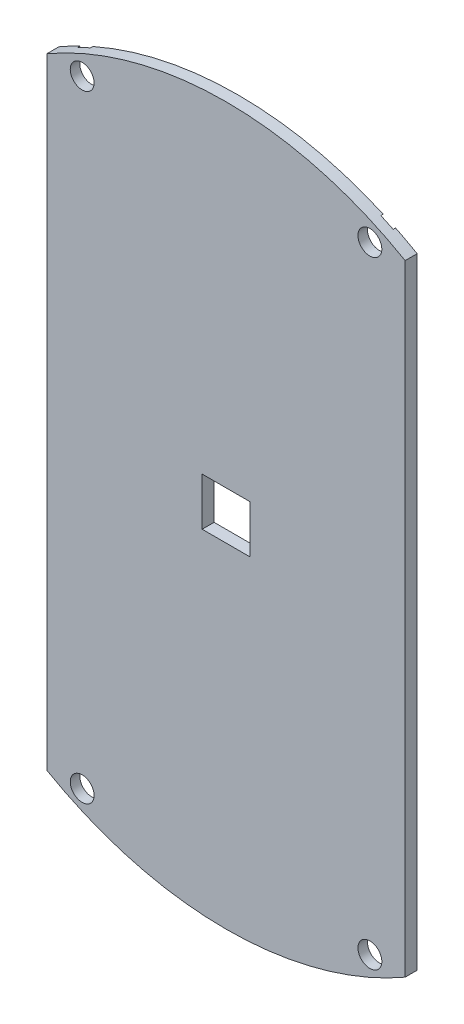
ISO-10303-21;
HEADER;
FILE_DESCRIPTION(('STEP AP214'),'2;1');
FILE_NAME('part.step','',(''),(''),'','','');
FILE_SCHEMA(('AUTOMOTIVE_DESIGN { 1 0 10303 214 1 1 1 1 }'));
ENDSEC;
DATA;
#1=APPLICATION_CONTEXT('core data for automotive mechanical design processes');
#2=APPLICATION_PROTOCOL_DEFINITION('international standard','automotive_design',2000,#1);
#3=PRODUCT_CONTEXT('',#1,'mechanical');
#4=PRODUCT('Part','Part','',(#3));
#5=PRODUCT_RELATED_PRODUCT_CATEGORY('part','',(#4));
#6=PRODUCT_DEFINITION_FORMATION('','',#4);
#7=PRODUCT_DEFINITION_CONTEXT('part definition',#1,'design');
#8=PRODUCT_DEFINITION('design','',#6,#7);
#9=PRODUCT_DEFINITION_SHAPE('','',#8);
#10=(LENGTH_UNIT() NAMED_UNIT(*) SI_UNIT(.MILLI.,.METRE.));
#11=(NAMED_UNIT(*) PLANE_ANGLE_UNIT() SI_UNIT($,.RADIAN.));
#12=(NAMED_UNIT(*) SI_UNIT($,.STERADIAN.) SOLID_ANGLE_UNIT());
#13=UNCERTAINTY_MEASURE_WITH_UNIT(LENGTH_MEASURE(1.E-05),#10,'distance_accuracy_value','');
#14=(GEOMETRIC_REPRESENTATION_CONTEXT(3) GLOBAL_UNCERTAINTY_ASSIGNED_CONTEXT((#13)) GLOBAL_UNIT_ASSIGNED_CONTEXT((#10,
#11,#12)) REPRESENTATION_CONTEXT('',''));
#15=CARTESIAN_POINT('',(0.,0.,0.));
#16=DIRECTION('',(0.,0.,1.));
#17=DIRECTION('',(1.,0.,0.));
#18=AXIS2_PLACEMENT_3D('',#15,#16,#17);
#19=CARTESIAN_POINT('',(0.,0.,0.));
#20=DIRECTION('',(0.,0.,1.));
#21=DIRECTION('',(1.,0.,0.));
#22=AXIS2_PLACEMENT_3D('',#19,#20,#21);
#23=PLANE('',#22);
#24=DIRECTION('',(0.,-1.,0.));
#25=VECTOR('',#24,1.);
#26=CARTESIAN_POINT('',(-5.08,5.08,0.));
#27=LINE('',#26,#25);
#28=CARTESIAN_POINT('',(-5.08,5.08,0.));
#29=VERTEX_POINT('',#28);
#30=CARTESIAN_POINT('',(-5.08,-5.08,0.));
#31=VERTEX_POINT('',#30);
#32=EDGE_CURVE('E220',#29,#31,#27,.T.);
#33=ORIENTED_EDGE('',*,*,#32,.T.);
#34=DIRECTION('',(1.,0.,0.));
#35=VECTOR('',#34,1.);
#36=CARTESIAN_POINT('',(-5.08,-5.08,0.));
#37=LINE('',#36,#35);
#38=CARTESIAN_POINT('',(5.08,-5.08,0.));
#39=VERTEX_POINT('',#38);
#40=EDGE_CURVE('E234',#31,#39,#37,.T.);
#41=ORIENTED_EDGE('',*,*,#40,.T.);
#42=DIRECTION('',(0.,1.,0.));
#43=VECTOR('',#42,1.);
#44=CARTESIAN_POINT('',(5.08,-5.08,0.));
#45=LINE('',#44,#43);
#46=CARTESIAN_POINT('',(5.08,5.08,0.));
#47=VERTEX_POINT('',#46);
#48=EDGE_CURVE('E237',#39,#47,#45,.T.);
#49=ORIENTED_EDGE('',*,*,#48,.T.);
#50=DIRECTION('',(-1.,0.,0.));
#51=VECTOR('',#50,1.);
#52=CARTESIAN_POINT('',(5.08,5.08,0.));
#53=LINE('',#52,#51);
#54=EDGE_CURVE('E224',#47,#29,#53,.T.);
#55=ORIENTED_EDGE('',*,*,#54,.T.);
#56=EDGE_LOOP('',(#33,#41,#49,#55));
#57=FACE_BOUND('',#56,.T.);
#58=CARTESIAN_POINT('',(0.,0.,0.));
#59=DIRECTION('',(0.,0.,1.));
#60=DIRECTION('',(1.,0.,0.));
#61=AXIS2_PLACEMENT_3D('',#58,#59,#60);
#62=CIRCLE('',#61,76.2);
#63=CARTESIAN_POINT('',(-30.8827248462581,-69.6613042231504,0.));
#64=VERTEX_POINT('',#63);
#65=CARTESIAN_POINT('',(30.8827248462582,-69.6613042231504,0.));
#66=VERTEX_POINT('',#65);
#67=EDGE_CURVE('E271',#64,#66,#62,.T.);
#68=ORIENTED_EDGE('',*,*,#67,.F.);
#69=CARTESIAN_POINT('',(-30.59333596741,-65.6076207035847,0.));
#70=DIRECTION('',(0.,0.,-1.));
#71=DIRECTION('',(0.642787609686538,-0.766044443118979,0.));
#72=AXIS2_PLACEMENT_3D('',#69,#70,#71);
#73=CIRCLE('',#72,4.064);
#74=CARTESIAN_POINT('',(-33.5126221160317,-68.4349629860941,0.));
#75=VERTEX_POINT('',#74);
#76=EDGE_CURVE('E151',#75,#64,#73,.T.);
#77=ORIENTED_EDGE('',*,*,#76,.F.);
#78=CARTESIAN_POINT('',(-38.1,-65.9911357683742,0.));
#79=VERTEX_POINT('',#78);
#80=EDGE_CURVE('E163',#79,#75,#62,.T.);
#81=ORIENTED_EDGE('',*,*,#80,.F.);
#82=DIRECTION('',(0.,-1.,0.));
#83=VECTOR('',#82,1.);
#84=CARTESIAN_POINT('',(-38.1,-65.9911357683742,0.));
#85=LINE('',#84,#83);
#86=CARTESIAN_POINT('',(-38.1,65.9911357683742,0.));
#87=VERTEX_POINT('',#86);
#88=EDGE_CURVE('E266',#87,#79,#85,.T.);
#89=ORIENTED_EDGE('',*,*,#88,.F.);
#90=CARTESIAN_POINT('',(0.,0.,0.));
#91=DIRECTION('',(0.,0.,1.));
#92=DIRECTION('',(1.,0.,0.));
#93=AXIS2_PLACEMENT_3D('',#90,#91,#92);
#94=CIRCLE('',#93,76.2);
#95=CARTESIAN_POINT('',(-33.5126221160317,68.4349629860941,0.));
#96=VERTEX_POINT('',#95);
#97=EDGE_CURVE('E251',#96,#87,#94,.T.);
#98=ORIENTED_EDGE('',*,*,#97,.F.);
#99=CARTESIAN_POINT('',(-30.59333596741,65.6076207035846,0.));
#100=DIRECTION('',(0.,0.,1.));
#101=DIRECTION('',(0.642787609686538,0.766044443118979,0.));
#102=AXIS2_PLACEMENT_3D('',#99,#100,#101);
#103=CIRCLE('',#102,4.064);
#104=CARTESIAN_POINT('',(-30.8827248462581,69.6613042231504,0.));
#105=VERTEX_POINT('',#104);
#106=EDGE_CURVE('E184',#96,#105,#103,.T.);
#107=ORIENTED_EDGE('',*,*,#106,.T.);
#108=CARTESIAN_POINT('',(30.8827248462582,69.6613042231504,0.));
#109=VERTEX_POINT('',#108);
#110=EDGE_CURVE('E267',#109,#105,#94,.T.);
#111=ORIENTED_EDGE('',*,*,#110,.F.);
#112=CARTESIAN_POINT('',(30.5933359674101,65.6076207035846,0.));
#113=DIRECTION('',(0.,0.,1.));
#114=DIRECTION('',(1.,0.,0.));
#115=AXIS2_PLACEMENT_3D('',#112,#113,#114);
#116=CIRCLE('',#115,4.064);
#117=CARTESIAN_POINT('',(33.5126221160317,68.434962986094,0.));
#118=VERTEX_POINT('',#117);
#119=EDGE_CURVE('E198',#109,#118,#116,.T.);
#120=ORIENTED_EDGE('',*,*,#119,.T.);
#121=CARTESIAN_POINT('',(38.1,65.9911357683742,0.));
#122=VERTEX_POINT('',#121);
#123=EDGE_CURVE('E263',#122,#118,#94,.T.);
#124=ORIENTED_EDGE('',*,*,#123,.F.);
#125=DIRECTION('',(0.,1.,0.));
#126=VECTOR('',#125,1.);
#127=CARTESIAN_POINT('',(38.1,-65.9911357683742,0.));
#128=LINE('',#127,#126);
#129=CARTESIAN_POINT('',(38.1,-65.9911357683742,0.));
#130=VERTEX_POINT('',#129);
#131=EDGE_CURVE('E256',#130,#122,#128,.T.);
#132=ORIENTED_EDGE('',*,*,#131,.F.);
#133=CARTESIAN_POINT('',(33.5126221160317,-68.434962986094,0.));
#134=VERTEX_POINT('',#133);
#135=EDGE_CURVE('E269',#134,#130,#62,.T.);
#136=ORIENTED_EDGE('',*,*,#135,.F.);
#137=CARTESIAN_POINT('',(30.5933359674101,-65.6076207035846,0.));
#138=DIRECTION('',(0.,0.,-1.));
#139=DIRECTION('',(1.,0.,0.));
#140=AXIS2_PLACEMENT_3D('',#137,#138,#139);
#141=CIRCLE('',#140,4.064);
#142=EDGE_CURVE('E170',#66,#134,#141,.T.);
#143=ORIENTED_EDGE('',*,*,#142,.F.);
#144=EDGE_LOOP('',(#68,#77,#81,#89,#98,#107,#111,#120,#124,#132,#136,#143));
#145=FACE_BOUND('',#144,.T.);
#146=ADVANCED_FACE('F33',(#57,#145),#23,.F.);
#147=CARTESIAN_POINT('',(0.,0.,2.54));
#148=DIRECTION('',(0.,0.,-1.));
#149=DIRECTION('',(-1.,0.,0.));
#150=AXIS2_PLACEMENT_3D('',#147,#148,#149);
#151=CYLINDRICAL_SURFACE('',#150,76.2);
#152=DIRECTION('',(0.,0.,-1.));
#153=VECTOR('',#152,1.);
#154=CARTESIAN_POINT('',(-30.8827248462581,69.6613042231504,0.508));
#155=LINE('',#154,#153);
#156=CARTESIAN_POINT('',(-30.8827248462581,69.6613042231504,0.508));
#157=VERTEX_POINT('',#156);
#158=EDGE_CURVE('E186',#157,#105,#155,.T.);
#159=ORIENTED_EDGE('',*,*,#158,.F.);
#160=CARTESIAN_POINT('',(0.,0.,0.508));
#161=DIRECTION('',(0.,0.,1.));
#162=DIRECTION('',(0.642787609686538,0.766044443118979,0.));
#163=AXIS2_PLACEMENT_3D('',#160,#161,#162);
#164=CIRCLE('',#163,76.2);
#165=CARTESIAN_POINT('',(-33.5126221160317,68.4349629860941,0.508));
#166=VERTEX_POINT('',#165);
#167=EDGE_CURVE('E180',#157,#166,#164,.T.);
#168=ORIENTED_EDGE('',*,*,#167,.T.);
#169=DIRECTION('',(0.,0.,-1.));
#170=VECTOR('',#169,1.);
#171=CARTESIAN_POINT('',(-33.5126221160317,68.4349629860941,0.508));
#172=LINE('',#171,#170);
#173=EDGE_CURVE('E190',#166,#96,#172,.T.);
#174=ORIENTED_EDGE('',*,*,#173,.T.);
#175=ORIENTED_EDGE('',*,*,#97,.T.);
#176=DIRECTION('',(0.,0.,-1.));
#177=VECTOR('',#176,1.);
#178=CARTESIAN_POINT('',(-38.1,65.9911357683742,2.54));
#179=LINE('',#178,#177);
#180=CARTESIAN_POINT('',(-38.1,65.9911357683742,2.54));
#181=VERTEX_POINT('',#180);
#182=EDGE_CURVE('E11',#181,#87,#179,.T.);
#183=ORIENTED_EDGE('',*,*,#182,.F.);
#184=CARTESIAN_POINT('',(0.,0.,2.54));
#185=DIRECTION('',(0.,0.,1.));
#186=DIRECTION('',(1.,0.,0.));
#187=AXIS2_PLACEMENT_3D('',#184,#185,#186);
#188=CIRCLE('',#187,76.2);
#189=CARTESIAN_POINT('',(38.1,65.9911357683742,2.54));
#190=VERTEX_POINT('',#189);
#191=EDGE_CURVE('E252',#190,#181,#188,.T.);
#192=ORIENTED_EDGE('',*,*,#191,.F.);
#193=DIRECTION('',(0.,0.,-1.));
#194=VECTOR('',#193,1.);
#195=CARTESIAN_POINT('',(38.1,65.9911357683742,2.54));
#196=LINE('',#195,#194);
#197=EDGE_CURVE('E262',#190,#122,#196,.T.);
#198=ORIENTED_EDGE('',*,*,#197,.T.);
#199=ORIENTED_EDGE('',*,*,#123,.T.);
#200=DIRECTION('',(0.,0.,-1.));
#201=VECTOR('',#200,1.);
#202=CARTESIAN_POINT('',(33.5126221160317,68.434962986094,0.508));
#203=LINE('',#202,#201);
#204=CARTESIAN_POINT('',(33.5126221160317,68.434962986094,0.508));
#205=VERTEX_POINT('',#204);
#206=EDGE_CURVE('E200',#205,#118,#203,.T.);
#207=ORIENTED_EDGE('',*,*,#206,.F.);
#208=CARTESIAN_POINT('',(0.,0.,0.508));
#209=DIRECTION('',(0.,0.,1.));
#210=DIRECTION('',(1.,0.,0.));
#211=AXIS2_PLACEMENT_3D('',#208,#209,#210);
#212=CIRCLE('',#211,76.2);
#213=CARTESIAN_POINT('',(30.8827248462582,69.6613042231504,0.508));
#214=VERTEX_POINT('',#213);
#215=EDGE_CURVE('E194',#205,#214,#212,.T.);
#216=ORIENTED_EDGE('',*,*,#215,.T.);
#217=DIRECTION('',(0.,0.,-1.));
#218=VECTOR('',#217,1.);
#219=CARTESIAN_POINT('',(30.8827248462582,69.6613042231504,0.508));
#220=LINE('',#219,#218);
#221=EDGE_CURVE('E204',#214,#109,#220,.T.);
#222=ORIENTED_EDGE('',*,*,#221,.T.);
#223=ORIENTED_EDGE('',*,*,#110,.T.);
#224=EDGE_LOOP('',(#159,#168,#174,#175,#183,#192,#198,#199,#207,#216,#222,#223));
#225=FACE_BOUND('',#224,.T.);
#226=ADVANCED_FACE('F35',(#225),#151,.T.);
#227=CARTESIAN_POINT('',(0.,0.,2.54));
#228=DIRECTION('',(0.,0.,1.));
#229=DIRECTION('',(1.,0.,0.));
#230=AXIS2_PLACEMENT_3D('',#227,#228,#229);
#231=PLANE('',#230);
#232=CARTESIAN_POINT('',(30.5933359674094,-65.6076207035859,2.54));
#233=DIRECTION('',(0.,0.,1.));
#234=DIRECTION('',(1.,0.,0.));
#235=AXIS2_PLACEMENT_3D('',#232,#233,#234);
#236=CIRCLE('',#235,2.54000000000187);
#237=CARTESIAN_POINT('',(33.1333359674112,-65.6076207035859,2.54));
#238=VERTEX_POINT('',#237);
#239=EDGE_CURVE('E211',#238,#238,#236,.T.);
#240=ORIENTED_EDGE('',*,*,#239,.F.);
#241=EDGE_LOOP('',(#240));
#242=FACE_BOUND('',#241,.T.);
#243=CARTESIAN_POINT('',(-30.5933359674093,-65.6076207035811,2.54));
#244=DIRECTION('',(0.,0.,1.));
#245=DIRECTION('',(1.,0.,0.));
#246=AXIS2_PLACEMENT_3D('',#243,#244,#245);
#247=CIRCLE('',#246,2.54000000000027);
#248=CARTESIAN_POINT('',(-28.053335967409,-65.6076207035811,2.54));
#249=VERTEX_POINT('',#248);
#250=EDGE_CURVE('E217',#249,#249,#247,.T.);
#251=ORIENTED_EDGE('',*,*,#250,.F.);
#252=EDGE_LOOP('',(#251));
#253=FACE_BOUND('',#252,.T.);
#254=ORIENTED_EDGE('',*,*,#191,.T.);
#255=DIRECTION('',(0.,-1.,0.));
#256=VECTOR('',#255,1.);
#257=CARTESIAN_POINT('',(-38.1,-65.9911357683742,2.54));
#258=LINE('',#257,#256);
#259=CARTESIAN_POINT('',(-38.1,-65.9911357683742,2.54));
#260=VERTEX_POINT('',#259);
#261=EDGE_CURVE('E255',#181,#260,#258,.T.);
#262=ORIENTED_EDGE('',*,*,#261,.T.);
#263=CARTESIAN_POINT('',(0.,0.,2.54));
#264=DIRECTION('',(0.,0.,1.));
#265=DIRECTION('',(1.,0.,0.));
#266=AXIS2_PLACEMENT_3D('',#263,#264,#265);
#267=CIRCLE('',#266,76.2);
#268=CARTESIAN_POINT('',(38.1,-65.9911357683742,2.54));
#269=VERTEX_POINT('',#268);
#270=EDGE_CURVE('E258',#260,#269,#267,.T.);
#271=ORIENTED_EDGE('',*,*,#270,.T.);
#272=DIRECTION('',(0.,1.,0.));
#273=VECTOR('',#272,1.);
#274=CARTESIAN_POINT('',(38.1,-65.9911357683742,2.54));
#275=LINE('',#274,#273);
#276=EDGE_CURVE('E260',#269,#190,#275,.T.);
#277=ORIENTED_EDGE('',*,*,#276,.T.);
#278=EDGE_LOOP('',(#254,#262,#271,#277));
#279=FACE_BOUND('',#278,.T.);
#280=DIRECTION('',(1.,0.,0.));
#281=VECTOR('',#280,1.);
#282=CARTESIAN_POINT('',(-5.08,-5.08,2.54));
#283=LINE('',#282,#281);
#284=CARTESIAN_POINT('',(-5.08,-5.08,2.54));
#285=VERTEX_POINT('',#284);
#286=CARTESIAN_POINT('',(5.08,-5.08,2.54));
#287=VERTEX_POINT('',#286);
#288=EDGE_CURVE('E223',#285,#287,#283,.T.);
#289=ORIENTED_EDGE('',*,*,#288,.F.);
#290=DIRECTION('',(0.,-1.,0.));
#291=VECTOR('',#290,1.);
#292=CARTESIAN_POINT('',(-5.08,5.08,2.54));
#293=LINE('',#292,#291);
#294=CARTESIAN_POINT('',(-5.08,5.08,2.54));
#295=VERTEX_POINT('',#294);
#296=EDGE_CURVE('E221',#295,#285,#293,.T.);
#297=ORIENTED_EDGE('',*,*,#296,.F.);
#298=DIRECTION('',(-1.,0.,0.));
#299=VECTOR('',#298,1.);
#300=CARTESIAN_POINT('',(5.08,5.08,2.54));
#301=LINE('',#300,#299);
#302=CARTESIAN_POINT('',(5.08,5.08,2.54));
#303=VERTEX_POINT('',#302);
#304=EDGE_CURVE('E229',#303,#295,#301,.T.);
#305=ORIENTED_EDGE('',*,*,#304,.F.);
#306=DIRECTION('',(0.,1.,0.));
#307=VECTOR('',#306,1.);
#308=CARTESIAN_POINT('',(5.08,-5.08,2.54));
#309=LINE('',#308,#307);
#310=EDGE_CURVE('E226',#287,#303,#309,.T.);
#311=ORIENTED_EDGE('',*,*,#310,.F.);
#312=EDGE_LOOP('',(#289,#297,#305,#311));
#313=FACE_BOUND('',#312,.T.);
#314=CARTESIAN_POINT('',(30.5933359674101,65.6076207035846,2.54));
#315=DIRECTION('',(0.,0.,1.));
#316=DIRECTION('',(-1.,0.,0.));
#317=AXIS2_PLACEMENT_3D('',#314,#315,#316);
#318=CIRCLE('',#317,2.54000000000046);
#319=CARTESIAN_POINT('',(28.0533359674096,65.6076207035846,2.54));
#320=VERTEX_POINT('',#319);
#321=EDGE_CURVE('E214',#320,#320,#318,.T.);
#322=ORIENTED_EDGE('',*,*,#321,.F.);
#323=EDGE_LOOP('',(#322));
#324=FACE_BOUND('',#323,.T.);
#325=CARTESIAN_POINT('',(-30.5933359674082,65.6076207035807,2.54));
#326=DIRECTION('',(0.,0.,1.));
#327=DIRECTION('',(-1.,0.,0.));
#328=AXIS2_PLACEMENT_3D('',#325,#326,#327);
#329=CIRCLE('',#328,2.53999999999924);
#330=CARTESIAN_POINT('',(-33.1333359674074,65.6076207035807,2.54));
#331=VERTEX_POINT('',#330);
#332=EDGE_CURVE('E208',#331,#331,#329,.T.);
#333=ORIENTED_EDGE('',*,*,#332,.F.);
#334=EDGE_LOOP('',(#333));
#335=FACE_BOUND('',#334,.T.);
#336=ADVANCED_FACE('F295',(#242,#253,#279,#313,#324,#335),#231,.T.);
#337=CARTESIAN_POINT('',(-38.1,-65.9911357683742,2.54));
#338=DIRECTION('',(1.,0.,0.));
#339=DIRECTION('',(0.,1.,0.));
#340=AXIS2_PLACEMENT_3D('',#337,#338,#339);
#341=PLANE('',#340);
#342=ORIENTED_EDGE('',*,*,#88,.T.);
#343=DIRECTION('',(0.,0.,-1.));
#344=VECTOR('',#343,1.);
#345=CARTESIAN_POINT('',(-38.1,-65.9911357683742,2.54));
#346=LINE('',#345,#344);
#347=EDGE_CURVE('E42',#260,#79,#346,.T.);
#348=ORIENTED_EDGE('',*,*,#347,.F.);
#349=ORIENTED_EDGE('',*,*,#261,.F.);
#350=ORIENTED_EDGE('',*,*,#182,.T.);
#351=EDGE_LOOP('',(#342,#348,#349,#350));
#352=FACE_BOUND('',#351,.T.);
#353=ADVANCED_FACE('F298',(#352),#341,.F.);
#354=CARTESIAN_POINT('',(0.,0.,2.54));
#355=DIRECTION('',(0.,0.,-1.));
#356=DIRECTION('',(-1.,0.,0.));
#357=AXIS2_PLACEMENT_3D('',#354,#355,#356);
#358=CYLINDRICAL_SURFACE('',#357,76.2);
#359=ORIENTED_EDGE('',*,*,#80,.T.);
#360=DIRECTION('',(0.,0.,-1.));
#361=VECTOR('',#360,1.);
#362=CARTESIAN_POINT('',(-33.5126221160317,-68.4349629860941,0.508));
#363=LINE('',#362,#361);
#364=CARTESIAN_POINT('',(-33.5126221160317,-68.4349629860941,0.508));
#365=VERTEX_POINT('',#364);
#366=EDGE_CURVE('E155',#365,#75,#363,.T.);
#367=ORIENTED_EDGE('',*,*,#366,.F.);
#368=CARTESIAN_POINT('',(0.,0.,0.508));
#369=DIRECTION('',(0.,0.,-1.));
#370=DIRECTION('',(0.642787609686538,-0.766044443118979,0.));
#371=AXIS2_PLACEMENT_3D('',#368,#369,#370);
#372=CIRCLE('',#371,76.2);
#373=CARTESIAN_POINT('',(-30.8827248462581,-69.6613042231504,0.508));
#374=VERTEX_POINT('',#373);
#375=EDGE_CURVE('E146',#374,#365,#372,.T.);
#376=ORIENTED_EDGE('',*,*,#375,.F.);
#377=DIRECTION('',(0.,0.,-1.));
#378=VECTOR('',#377,1.);
#379=CARTESIAN_POINT('',(-30.8827248462581,-69.6613042231504,0.508));
#380=LINE('',#379,#378);
#381=EDGE_CURVE('E157',#374,#64,#380,.T.);
#382=ORIENTED_EDGE('',*,*,#381,.T.);
#383=ORIENTED_EDGE('',*,*,#67,.T.);
#384=DIRECTION('',(0.,0.,-1.));
#385=VECTOR('',#384,1.);
#386=CARTESIAN_POINT('',(30.8827248462582,-69.6613042231504,0.508));
#387=LINE('',#386,#385);
#388=CARTESIAN_POINT('',(30.8827248462582,-69.6613042231504,0.508));
#389=VERTEX_POINT('',#388);
#390=EDGE_CURVE('E172',#389,#66,#387,.T.);
#391=ORIENTED_EDGE('',*,*,#390,.F.);
#392=CARTESIAN_POINT('',(0.,0.,0.508));
#393=DIRECTION('',(0.,0.,-1.));
#394=DIRECTION('',(1.,0.,0.));
#395=AXIS2_PLACEMENT_3D('',#392,#393,#394);
#396=CIRCLE('',#395,76.2);
#397=CARTESIAN_POINT('',(33.5126221160317,-68.434962986094,0.508));
#398=VERTEX_POINT('',#397);
#399=EDGE_CURVE('E168',#398,#389,#396,.T.);
#400=ORIENTED_EDGE('',*,*,#399,.F.);
#401=DIRECTION('',(0.,0.,-1.));
#402=VECTOR('',#401,1.);
#403=CARTESIAN_POINT('',(33.5126221160317,-68.434962986094,0.508));
#404=LINE('',#403,#402);
#405=EDGE_CURVE('E176',#398,#134,#404,.T.);
#406=ORIENTED_EDGE('',*,*,#405,.T.);
#407=ORIENTED_EDGE('',*,*,#135,.T.);
#408=DIRECTION('',(0.,0.,-1.));
#409=VECTOR('',#408,1.);
#410=CARTESIAN_POINT('',(38.1,-65.9911357683742,2.54));
#411=LINE('',#410,#409);
#412=EDGE_CURVE('E275',#269,#130,#411,.T.);
#413=ORIENTED_EDGE('',*,*,#412,.F.);
#414=ORIENTED_EDGE('',*,*,#270,.F.);
#415=ORIENTED_EDGE('',*,*,#347,.T.);
#416=EDGE_LOOP('',(#359,#367,#376,#382,#383,#391,#400,#406,#407,#413,#414,#415));
#417=FACE_BOUND('',#416,.T.);
#418=ADVANCED_FACE('F160',(#417),#358,.T.);
#419=CARTESIAN_POINT('',(38.1,-65.9911357683742,2.54));
#420=DIRECTION('',(-1.,0.,0.));
#421=DIRECTION('',(0.,-1.,0.));
#422=AXIS2_PLACEMENT_3D('',#419,#420,#421);
#423=PLANE('',#422);
#424=ORIENTED_EDGE('',*,*,#131,.T.);
#425=ORIENTED_EDGE('',*,*,#197,.F.);
#426=ORIENTED_EDGE('',*,*,#276,.F.);
#427=ORIENTED_EDGE('',*,*,#412,.T.);
#428=EDGE_LOOP('',(#424,#425,#426,#427));
#429=FACE_BOUND('',#428,.T.);
#430=ADVANCED_FACE('F334',(#429),#423,.F.);
#431=CARTESIAN_POINT('',(-5.08,5.08,2.54));
#432=DIRECTION('',(1.,0.,0.));
#433=DIRECTION('',(0.,1.,0.));
#434=AXIS2_PLACEMENT_3D('',#431,#432,#433);
#435=PLANE('',#434);
#436=ORIENTED_EDGE('',*,*,#32,.F.);
#437=DIRECTION('',(0.,0.,-1.));
#438=VECTOR('',#437,1.);
#439=CARTESIAN_POINT('',(-5.08,5.08,2.54));
#440=LINE('',#439,#438);
#441=EDGE_CURVE('E231',#295,#29,#440,.T.);
#442=ORIENTED_EDGE('',*,*,#441,.F.);
#443=ORIENTED_EDGE('',*,*,#296,.T.);
#444=DIRECTION('',(0.,0.,-1.));
#445=VECTOR('',#444,1.);
#446=CARTESIAN_POINT('',(-5.08,-5.08,2.54));
#447=LINE('',#446,#445);
#448=EDGE_CURVE('E248',#285,#31,#447,.T.);
#449=ORIENTED_EDGE('',*,*,#448,.T.);
#450=EDGE_LOOP('',(#436,#442,#443,#449));
#451=FACE_BOUND('',#450,.T.);
#452=ADVANCED_FACE('F337',(#451),#435,.T.);
#453=CARTESIAN_POINT('',(-5.08,-5.08,2.54));
#454=DIRECTION('',(0.,1.,0.));
#455=DIRECTION('',(0.,0.,1.));
#456=AXIS2_PLACEMENT_3D('',#453,#454,#455);
#457=PLANE('',#456);
#458=ORIENTED_EDGE('',*,*,#40,.F.);
#459=ORIENTED_EDGE('',*,*,#448,.F.);
#460=ORIENTED_EDGE('',*,*,#288,.T.);
#461=DIRECTION('',(0.,0.,-1.));
#462=VECTOR('',#461,1.);
#463=CARTESIAN_POINT('',(5.08,-5.08,2.54));
#464=LINE('',#463,#462);
#465=EDGE_CURVE('E246',#287,#39,#464,.T.);
#466=ORIENTED_EDGE('',*,*,#465,.T.);
#467=EDGE_LOOP('',(#458,#459,#460,#466));
#468=FACE_BOUND('',#467,.T.);
#469=ADVANCED_FACE('F407',(#468),#457,.T.);
#470=CARTESIAN_POINT('',(5.08,-5.08,2.54));
#471=DIRECTION('',(-1.,0.,0.));
#472=DIRECTION('',(0.,0.,1.));
#473=AXIS2_PLACEMENT_3D('',#470,#471,#472);
#474=PLANE('',#473);
#475=ORIENTED_EDGE('',*,*,#48,.F.);
#476=ORIENTED_EDGE('',*,*,#465,.F.);
#477=ORIENTED_EDGE('',*,*,#310,.T.);
#478=DIRECTION('',(0.,0.,-1.));
#479=VECTOR('',#478,1.);
#480=CARTESIAN_POINT('',(5.08,5.08,2.54));
#481=LINE('',#480,#479);
#482=EDGE_CURVE('E244',#303,#47,#481,.T.);
#483=ORIENTED_EDGE('',*,*,#482,.T.);
#484=EDGE_LOOP('',(#475,#476,#477,#483));
#485=FACE_BOUND('',#484,.T.);
#486=ADVANCED_FACE('F403',(#485),#474,.T.);
#487=CARTESIAN_POINT('',(5.08,5.08,2.54));
#488=DIRECTION('',(0.,-1.,0.));
#489=DIRECTION('',(1.,0.,0.));
#490=AXIS2_PLACEMENT_3D('',#487,#488,#489);
#491=PLANE('',#490);
#492=ORIENTED_EDGE('',*,*,#54,.F.);
#493=ORIENTED_EDGE('',*,*,#482,.F.);
#494=ORIENTED_EDGE('',*,*,#304,.T.);
#495=ORIENTED_EDGE('',*,*,#441,.T.);
#496=EDGE_LOOP('',(#492,#493,#494,#495));
#497=FACE_BOUND('',#496,.T.);
#498=ADVANCED_FACE('F397',(#497),#491,.T.);
#499=CARTESIAN_POINT('',(-30.5933359674093,-65.6076207035811,2.54));
#500=DIRECTION('',(0.,0.,-1.));
#501=DIRECTION('',(-1.,0.,0.));
#502=AXIS2_PLACEMENT_3D('',#499,#500,#501);
#503=CYLINDRICAL_SURFACE('',#502,2.54000000000027);
#504=CARTESIAN_POINT('',(-30.5933359674093,-65.6076207035811,0.508));
#505=DIRECTION('',(0.,0.,1.));
#506=DIRECTION('',(1.,0.,0.));
#507=AXIS2_PLACEMENT_3D('',#504,#505,#506);
#508=CIRCLE('',#507,2.54000000000027);
#509=CARTESIAN_POINT('',(-28.053335967409,-65.6076207035811,0.508));
#510=VERTEX_POINT('',#509);
#511=EDGE_CURVE('E37',#510,#510,#508,.T.);
#512=ORIENTED_EDGE('',*,*,#511,.F.);
#513=EDGE_LOOP('',(#512));
#514=FACE_BOUND('',#513,.T.);
#515=ORIENTED_EDGE('',*,*,#250,.T.);
#516=EDGE_LOOP('',(#515));
#517=FACE_BOUND('',#516,.T.);
#518=ADVANCED_FACE('F392',(#514,#517),#503,.F.);
#519=CARTESIAN_POINT('',(30.5933359674101,65.6076207035846,2.54));
#520=DIRECTION('',(0.,0.,-1.));
#521=DIRECTION('',(-1.,0.,0.));
#522=AXIS2_PLACEMENT_3D('',#519,#520,#521);
#523=CYLINDRICAL_SURFACE('',#522,2.54000000000046);
#524=CARTESIAN_POINT('',(30.5933359674101,65.6076207035846,0.508));
#525=DIRECTION('',(0.,0.,1.));
#526=DIRECTION('',(1.,0.,0.));
#527=AXIS2_PLACEMENT_3D('',#524,#525,#526);
#528=CIRCLE('',#527,2.54000000000046);
#529=CARTESIAN_POINT('',(33.1333359674105,65.6076207035846,0.508));
#530=VERTEX_POINT('',#529);
#531=EDGE_CURVE('E207',#530,#530,#528,.T.);
#532=ORIENTED_EDGE('',*,*,#531,.F.);
#533=EDGE_LOOP('',(#532));
#534=FACE_BOUND('',#533,.T.);
#535=ORIENTED_EDGE('',*,*,#321,.T.);
#536=EDGE_LOOP('',(#535));
#537=FACE_BOUND('',#536,.T.);
#538=ADVANCED_FACE('F291',(#534,#537),#523,.F.);
#539=CARTESIAN_POINT('',(30.5933359674094,-65.6076207035859,2.54));
#540=DIRECTION('',(0.,0.,-1.));
#541=DIRECTION('',(-1.,0.,0.));
#542=AXIS2_PLACEMENT_3D('',#539,#540,#541);
#543=CYLINDRICAL_SURFACE('',#542,2.54000000000187);
#544=CARTESIAN_POINT('',(30.5933359674094,-65.6076207035859,0.508));
#545=DIRECTION('',(0.,0.,1.));
#546=DIRECTION('',(1.,0.,0.));
#547=AXIS2_PLACEMENT_3D('',#544,#545,#546);
#548=CIRCLE('',#547,2.54000000000187);
#549=CARTESIAN_POINT('',(33.1333359674112,-65.6076207035859,0.508));
#550=VERTEX_POINT('',#549);
#551=EDGE_CURVE('E179',#550,#550,#548,.T.);
#552=ORIENTED_EDGE('',*,*,#551,.F.);
#553=EDGE_LOOP('',(#552));
#554=FACE_BOUND('',#553,.T.);
#555=ORIENTED_EDGE('',*,*,#239,.T.);
#556=EDGE_LOOP('',(#555));
#557=FACE_BOUND('',#556,.T.);
#558=ADVANCED_FACE('F287',(#554,#557),#543,.F.);
#559=CARTESIAN_POINT('',(-30.5933359674082,65.6076207035807,2.54));
#560=DIRECTION('',(0.,0.,-1.));
#561=DIRECTION('',(-1.,0.,0.));
#562=AXIS2_PLACEMENT_3D('',#559,#560,#561);
#563=CYLINDRICAL_SURFACE('',#562,2.53999999999924);
#564=CARTESIAN_POINT('',(-30.5933359674082,65.6076207035807,0.508));
#565=DIRECTION('',(0.,0.,1.));
#566=DIRECTION('',(1.,0.,0.));
#567=AXIS2_PLACEMENT_3D('',#564,#565,#566);
#568=CIRCLE('',#567,2.53999999999924);
#569=CARTESIAN_POINT('',(-28.053335967409,65.6076207035807,0.508));
#570=VERTEX_POINT('',#569);
#571=EDGE_CURVE('E193',#570,#570,#568,.T.);
#572=ORIENTED_EDGE('',*,*,#571,.F.);
#573=EDGE_LOOP('',(#572));
#574=FACE_BOUND('',#573,.T.);
#575=ORIENTED_EDGE('',*,*,#332,.T.);
#576=EDGE_LOOP('',(#575));
#577=FACE_BOUND('',#576,.T.);
#578=ADVANCED_FACE('F290',(#574,#577),#563,.F.);
#579=CARTESIAN_POINT('',(30.5933359674101,65.6076207035846,0.508));
#580=DIRECTION('',(0.,0.,-1.));
#581=DIRECTION('',(-1.,0.,0.));
#582=AXIS2_PLACEMENT_3D('',#579,#580,#581);
#583=CYLINDRICAL_SURFACE('',#582,4.064);
#584=ORIENTED_EDGE('',*,*,#119,.F.);
#585=ORIENTED_EDGE('',*,*,#221,.F.);
#586=CARTESIAN_POINT('',(30.5933359674101,65.6076207035846,0.508));
#587=DIRECTION('',(0.,0.,1.));
#588=DIRECTION('',(1.,0.,0.));
#589=AXIS2_PLACEMENT_3D('',#586,#587,#588);
#590=CIRCLE('',#589,4.064);
#591=EDGE_CURVE('E197',#214,#205,#590,.T.);
#592=ORIENTED_EDGE('',*,*,#591,.T.);
#593=ORIENTED_EDGE('',*,*,#206,.T.);
#594=EDGE_LOOP('',(#584,#585,#592,#593));
#595=FACE_BOUND('',#594,.T.);
#596=ADVANCED_FACE('F314',(#595),#583,.F.);
#597=CARTESIAN_POINT('',(15.296667983705,32.8038103517923,0.508));
#598=DIRECTION('',(0.,0.,1.));
#599=DIRECTION('',(1.,0.,0.));
#600=AXIS2_PLACEMENT_3D('',#597,#598,#599);
#601=PLANE('',#600);
#602=ORIENTED_EDGE('',*,*,#531,.T.);
#603=EDGE_LOOP('',(#602));
#604=FACE_BOUND('',#603,.T.);
#605=ORIENTED_EDGE('',*,*,#215,.F.);
#606=ORIENTED_EDGE('',*,*,#591,.F.);
#607=EDGE_LOOP('',(#605,#606));
#608=FACE_BOUND('',#607,.T.);
#609=ADVANCED_FACE('F320',(#604,#608),#601,.F.);
#610=CARTESIAN_POINT('',(-30.59333596741,65.6076207035846,0.508));
#611=DIRECTION('',(0.,0.,-1.));
#612=DIRECTION('',(-1.,0.,0.));
#613=AXIS2_PLACEMENT_3D('',#610,#611,#612);
#614=CYLINDRICAL_SURFACE('',#613,4.064);
#615=ORIENTED_EDGE('',*,*,#106,.F.);
#616=ORIENTED_EDGE('',*,*,#173,.F.);
#617=CARTESIAN_POINT('',(-30.59333596741,65.6076207035846,0.508));
#618=DIRECTION('',(0.,0.,1.));
#619=DIRECTION('',(0.642787609686538,0.766044443118979,0.));
#620=AXIS2_PLACEMENT_3D('',#617,#618,#619);
#621=CIRCLE('',#620,4.064);
#622=EDGE_CURVE('E183',#166,#157,#621,.T.);
#623=ORIENTED_EDGE('',*,*,#622,.T.);
#624=ORIENTED_EDGE('',*,*,#158,.T.);
#625=EDGE_LOOP('',(#615,#616,#623,#624));
#626=FACE_BOUND('',#625,.T.);
#627=ADVANCED_FACE('F364',(#626),#614,.F.);
#628=CARTESIAN_POINT('',(-15.296667983705,32.8038103517923,0.508));
#629=DIRECTION('',(0.,0.,1.));
#630=DIRECTION('',(0.642787609686538,0.766044443118979,0.));
#631=AXIS2_PLACEMENT_3D('',#628,#629,#630);
#632=PLANE('',#631);
#633=ORIENTED_EDGE('',*,*,#571,.T.);
#634=EDGE_LOOP('',(#633));
#635=FACE_BOUND('',#634,.T.);
#636=ORIENTED_EDGE('',*,*,#167,.F.);
#637=ORIENTED_EDGE('',*,*,#622,.F.);
#638=EDGE_LOOP('',(#636,#637));
#639=FACE_BOUND('',#638,.T.);
#640=ADVANCED_FACE('F368',(#635,#639),#632,.F.);
#641=CARTESIAN_POINT('',(30.5933359674101,-65.6076207035846,0.508));
#642=DIRECTION('',(0.,0.,-1.));
#643=DIRECTION('',(-1.,0.,0.));
#644=AXIS2_PLACEMENT_3D('',#641,#642,#643);
#645=CYLINDRICAL_SURFACE('',#644,4.064);
#646=ORIENTED_EDGE('',*,*,#142,.T.);
#647=ORIENTED_EDGE('',*,*,#405,.F.);
#648=CARTESIAN_POINT('',(30.5933359674101,-65.6076207035846,0.508));
#649=DIRECTION('',(0.,0.,-1.));
#650=DIRECTION('',(1.,0.,0.));
#651=AXIS2_PLACEMENT_3D('',#648,#649,#650);
#652=CIRCLE('',#651,4.064);
#653=EDGE_CURVE('E56',#389,#398,#652,.T.);
#654=ORIENTED_EDGE('',*,*,#653,.F.);
#655=ORIENTED_EDGE('',*,*,#390,.T.);
#656=EDGE_LOOP('',(#646,#647,#654,#655));
#657=FACE_BOUND('',#656,.T.);
#658=ADVANCED_FACE('F354',(#657),#645,.F.);
#659=CARTESIAN_POINT('',(15.296667983705,-32.8038103517923,0.508));
#660=DIRECTION('',(0.,0.,1.));
#661=DIRECTION('',(1.,0.,0.));
#662=AXIS2_PLACEMENT_3D('',#659,#660,#661);
#663=PLANE('',#662);
#664=ORIENTED_EDGE('',*,*,#551,.T.);
#665=EDGE_LOOP('',(#664));
#666=FACE_BOUND('',#665,.T.);
#667=ORIENTED_EDGE('',*,*,#399,.T.);
#668=ORIENTED_EDGE('',*,*,#653,.T.);
#669=EDGE_LOOP('',(#667,#668));
#670=FACE_BOUND('',#669,.T.);
#671=ADVANCED_FACE('F285',(#666,#670),#663,.F.);
#672=CARTESIAN_POINT('',(-30.59333596741,-65.6076207035847,0.508));
#673=DIRECTION('',(0.,0.,-1.));
#674=DIRECTION('',(-1.,0.,0.));
#675=AXIS2_PLACEMENT_3D('',#672,#673,#674);
#676=CYLINDRICAL_SURFACE('',#675,4.064);
#677=ORIENTED_EDGE('',*,*,#76,.T.);
#678=ORIENTED_EDGE('',*,*,#381,.F.);
#679=CARTESIAN_POINT('',(-30.59333596741,-65.6076207035847,0.508));
#680=DIRECTION('',(0.,0.,-1.));
#681=DIRECTION('',(0.642787609686538,-0.766044443118979,0.));
#682=AXIS2_PLACEMENT_3D('',#679,#680,#681);
#683=CIRCLE('',#682,4.064);
#684=EDGE_CURVE('E49',#365,#374,#683,.T.);
#685=ORIENTED_EDGE('',*,*,#684,.F.);
#686=ORIENTED_EDGE('',*,*,#366,.T.);
#687=EDGE_LOOP('',(#677,#678,#685,#686));
#688=FACE_BOUND('',#687,.T.);
#689=ADVANCED_FACE('F154',(#688),#676,.F.);
#690=CARTESIAN_POINT('',(-15.296667983705,-32.8038103517923,0.508));
#691=DIRECTION('',(0.,0.,1.));
#692=DIRECTION('',(0.642787609686538,-0.766044443118979,0.));
#693=AXIS2_PLACEMENT_3D('',#690,#691,#692);
#694=PLANE('',#693);
#695=ORIENTED_EDGE('',*,*,#511,.T.);
#696=EDGE_LOOP('',(#695));
#697=FACE_BOUND('',#696,.T.);
#698=ORIENTED_EDGE('',*,*,#375,.T.);
#699=ORIENTED_EDGE('',*,*,#684,.T.);
#700=EDGE_LOOP('',(#698,#699));
#701=FACE_BOUND('',#700,.T.);
#702=ADVANCED_FACE('F147',(#697,#701),#694,.F.);
#703=CLOSED_SHELL('',(#146,#226,#336,#353,#418,#430,#452,#469,#486,#498,#518,#538,#558,#578,
#596,#609,#627,#640,#658,#671,#689,#702));
#704=MANIFOLD_SOLID_BREP('B2',#703);
#705=ADVANCED_BREP_SHAPE_REPRESENTATION('',(#18,#704),#14);
#706=SHAPE_DEFINITION_REPRESENTATION(#9,#705);
ENDSEC;
END-ISO-10303-21;
